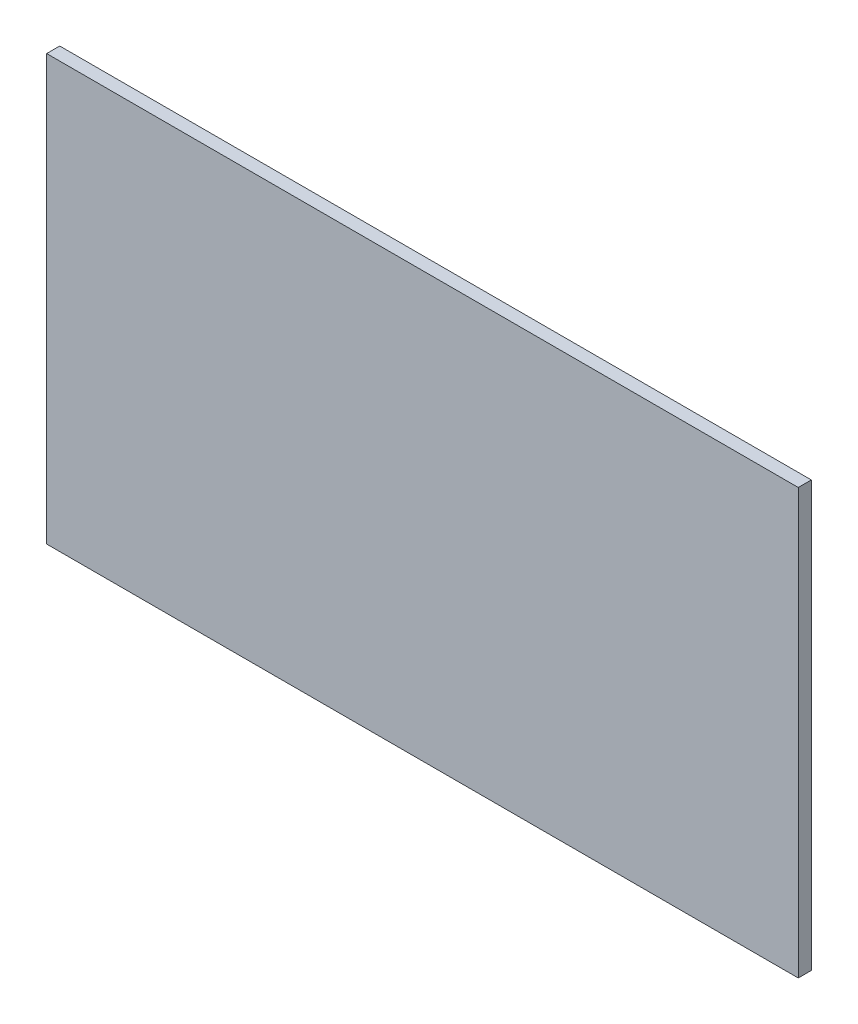
ISO-10303-21;
HEADER;
FILE_DESCRIPTION(('STEP AP214'),'2;1');
FILE_NAME('part.step','',(''),(''),'','','');
FILE_SCHEMA(('AUTOMOTIVE_DESIGN { 1 0 10303 214 1 1 1 1 }'));
ENDSEC;
DATA;
#1=APPLICATION_CONTEXT('core data for automotive mechanical design processes');
#2=APPLICATION_PROTOCOL_DEFINITION('international standard','automotive_design',2000,#1);
#3=PRODUCT_CONTEXT('',#1,'mechanical');
#4=PRODUCT('Part','Part','',(#3));
#5=PRODUCT_RELATED_PRODUCT_CATEGORY('part','',(#4));
#6=PRODUCT_DEFINITION_FORMATION('','',#4);
#7=PRODUCT_DEFINITION_CONTEXT('part definition',#1,'design');
#8=PRODUCT_DEFINITION('design','',#6,#7);
#9=PRODUCT_DEFINITION_SHAPE('','',#8);
#10=(LENGTH_UNIT() NAMED_UNIT(*) SI_UNIT(.MILLI.,.METRE.));
#11=(NAMED_UNIT(*) PLANE_ANGLE_UNIT() SI_UNIT($,.RADIAN.));
#12=(NAMED_UNIT(*) SI_UNIT($,.STERADIAN.) SOLID_ANGLE_UNIT());
#13=UNCERTAINTY_MEASURE_WITH_UNIT(LENGTH_MEASURE(1.E-05),#10,'distance_accuracy_value','');
#14=(GEOMETRIC_REPRESENTATION_CONTEXT(3) GLOBAL_UNCERTAINTY_ASSIGNED_CONTEXT((#13)) GLOBAL_UNIT_ASSIGNED_CONTEXT((#10,
#11,#12)) REPRESENTATION_CONTEXT('',''));
#15=CARTESIAN_POINT('',(0.,0.,0.));
#16=DIRECTION('',(0.,0.,1.));
#17=DIRECTION('',(1.,0.,0.));
#18=AXIS2_PLACEMENT_3D('',#15,#16,#17);
#19=CARTESIAN_POINT('',(0.,0.,4.));
#20=DIRECTION('',(1.,0.,0.));
#21=DIRECTION('',(0.,1.,0.));
#22=AXIS2_PLACEMENT_3D('',#19,#20,#21);
#23=PLANE('',#22);
#24=DIRECTION('',(0.,-1.,0.));
#25=VECTOR('',#24,1.);
#26=CARTESIAN_POINT('',(0.,0.,0.));
#27=LINE('',#26,#25);
#28=CARTESIAN_POINT('',(0.,0.,0.));
#29=VERTEX_POINT('',#28);
#30=CARTESIAN_POINT('',(0.,-130.,0.));
#31=VERTEX_POINT('',#30);
#32=EDGE_CURVE('E113',#29,#31,#27,.T.);
#33=ORIENTED_EDGE('',*,*,#32,.T.);
#34=DIRECTION('',(0.,0.,-1.));
#35=VECTOR('',#34,1.);
#36=CARTESIAN_POINT('',(0.,-130.,4.));
#37=LINE('',#36,#35);
#38=CARTESIAN_POINT('',(0.,-130.,4.));
#39=VERTEX_POINT('',#38);
#40=EDGE_CURVE('E11',#39,#31,#37,.T.);
#41=ORIENTED_EDGE('',*,*,#40,.F.);
#42=DIRECTION('',(0.,-1.,0.));
#43=VECTOR('',#42,1.);
#44=CARTESIAN_POINT('',(0.,0.,4.));
#45=LINE('',#44,#43);
#46=CARTESIAN_POINT('',(0.,0.,4.));
#47=VERTEX_POINT('',#46);
#48=EDGE_CURVE('E97',#47,#39,#45,.T.);
#49=ORIENTED_EDGE('',*,*,#48,.F.);
#50=DIRECTION('',(0.,0.,-1.));
#51=VECTOR('',#50,1.);
#52=CARTESIAN_POINT('',(0.,0.,4.));
#53=LINE('',#52,#51);
#54=EDGE_CURVE('E109',#47,#29,#53,.T.);
#55=ORIENTED_EDGE('',*,*,#54,.T.);
#56=EDGE_LOOP('',(#33,#41,#49,#55));
#57=FACE_BOUND('',#56,.T.);
#58=ADVANCED_FACE('F45',(#57),#23,.F.);
#59=CARTESIAN_POINT('',(0.,-130.,4.));
#60=DIRECTION('',(0.,1.,0.));
#61=DIRECTION('',(0.,0.,1.));
#62=AXIS2_PLACEMENT_3D('',#59,#60,#61);
#63=PLANE('',#62);
#64=DIRECTION('',(1.,0.,0.));
#65=VECTOR('',#64,1.);
#66=CARTESIAN_POINT('',(0.,-130.,0.));
#67=LINE('',#66,#65);
#68=CARTESIAN_POINT('',(230.,-130.,0.));
#69=VERTEX_POINT('',#68);
#70=EDGE_CURVE('E102',#31,#69,#67,.T.);
#71=ORIENTED_EDGE('',*,*,#70,.T.);
#72=DIRECTION('',(0.,0.,-1.));
#73=VECTOR('',#72,1.);
#74=CARTESIAN_POINT('',(230.,-130.,4.));
#75=LINE('',#74,#73);
#76=CARTESIAN_POINT('',(230.,-130.,4.));
#77=VERTEX_POINT('',#76);
#78=EDGE_CURVE('E54',#77,#69,#75,.T.);
#79=ORIENTED_EDGE('',*,*,#78,.F.);
#80=DIRECTION('',(1.,0.,0.));
#81=VECTOR('',#80,1.);
#82=CARTESIAN_POINT('',(0.,-130.,4.));
#83=LINE('',#82,#81);
#84=EDGE_CURVE('E92',#39,#77,#83,.T.);
#85=ORIENTED_EDGE('',*,*,#84,.F.);
#86=ORIENTED_EDGE('',*,*,#40,.T.);
#87=EDGE_LOOP('',(#71,#79,#85,#86));
#88=FACE_BOUND('',#87,.T.);
#89=ADVANCED_FACE('F101',(#88),#63,.F.);
#90=CARTESIAN_POINT('',(230.,0.,4.));
#91=DIRECTION('',(-1.,0.,0.));
#92=DIRECTION('',(0.,-1.,0.));
#93=AXIS2_PLACEMENT_3D('',#90,#91,#92);
#94=PLANE('',#93);
#95=DIRECTION('',(0.,1.,0.));
#96=VECTOR('',#95,1.);
#97=CARTESIAN_POINT('',(230.,0.,0.));
#98=LINE('',#97,#96);
#99=CARTESIAN_POINT('',(230.,0.,0.));
#100=VERTEX_POINT('',#99);
#101=EDGE_CURVE('E79',#69,#100,#98,.T.);
#102=ORIENTED_EDGE('',*,*,#101,.T.);
#103=DIRECTION('',(0.,0.,-1.));
#104=VECTOR('',#103,1.);
#105=CARTESIAN_POINT('',(230.,0.,4.));
#106=LINE('',#105,#104);
#107=CARTESIAN_POINT('',(230.,0.,4.));
#108=VERTEX_POINT('',#107);
#109=EDGE_CURVE('E104',#108,#100,#106,.T.);
#110=ORIENTED_EDGE('',*,*,#109,.F.);
#111=DIRECTION('',(0.,1.,0.));
#112=VECTOR('',#111,1.);
#113=CARTESIAN_POINT('',(230.,0.,4.));
#114=LINE('',#113,#112);
#115=EDGE_CURVE('E95',#77,#108,#114,.T.);
#116=ORIENTED_EDGE('',*,*,#115,.F.);
#117=ORIENTED_EDGE('',*,*,#78,.T.);
#118=EDGE_LOOP('',(#102,#110,#116,#117));
#119=FACE_BOUND('',#118,.T.);
#120=ADVANCED_FACE('F105',(#119),#94,.F.);
#121=CARTESIAN_POINT('',(0.,0.,4.));
#122=DIRECTION('',(0.,-1.,0.));
#123=DIRECTION('',(0.,0.,-1.));
#124=AXIS2_PLACEMENT_3D('',#121,#122,#123);
#125=PLANE('',#124);
#126=DIRECTION('',(-1.,0.,0.));
#127=VECTOR('',#126,1.);
#128=CARTESIAN_POINT('',(0.,0.,0.));
#129=LINE('',#128,#127);
#130=EDGE_CURVE('E85',#100,#29,#129,.T.);
#131=ORIENTED_EDGE('',*,*,#130,.T.);
#132=ORIENTED_EDGE('',*,*,#54,.F.);
#133=DIRECTION('',(-1.,0.,0.));
#134=VECTOR('',#133,1.);
#135=CARTESIAN_POINT('',(0.,0.,4.));
#136=LINE('',#135,#134);
#137=EDGE_CURVE('E62',#108,#47,#136,.T.);
#138=ORIENTED_EDGE('',*,*,#137,.F.);
#139=ORIENTED_EDGE('',*,*,#109,.T.);
#140=EDGE_LOOP('',(#131,#132,#138,#139));
#141=FACE_BOUND('',#140,.T.);
#142=ADVANCED_FACE('F126',(#141),#125,.F.);
#143=CARTESIAN_POINT('',(0.,0.,4.));
#144=DIRECTION('',(0.,0.,1.));
#145=DIRECTION('',(1.,0.,0.));
#146=AXIS2_PLACEMENT_3D('',#143,#144,#145);
#147=PLANE('',#146);
#148=ORIENTED_EDGE('',*,*,#48,.T.);
#149=ORIENTED_EDGE('',*,*,#84,.T.);
#150=ORIENTED_EDGE('',*,*,#115,.T.);
#151=ORIENTED_EDGE('',*,*,#137,.T.);
#152=EDGE_LOOP('',(#148,#149,#150,#151));
#153=FACE_BOUND('',#152,.T.);
#154=ADVANCED_FACE('F93',(#153),#147,.T.);
#155=CARTESIAN_POINT('',(0.,0.,0.));
#156=DIRECTION('',(0.,0.,1.));
#157=DIRECTION('',(1.,0.,0.));
#158=AXIS2_PLACEMENT_3D('',#155,#156,#157);
#159=PLANE('',#158);
#160=ORIENTED_EDGE('',*,*,#32,.F.);
#161=ORIENTED_EDGE('',*,*,#130,.F.);
#162=ORIENTED_EDGE('',*,*,#101,.F.);
#163=ORIENTED_EDGE('',*,*,#70,.F.);
#164=EDGE_LOOP('',(#160,#161,#162,#163));
#165=FACE_BOUND('',#164,.T.);
#166=ADVANCED_FACE('F129',(#165),#159,.F.);
#167=CLOSED_SHELL('',(#58,#89,#120,#142,#154,#166));
#168=MANIFOLD_SOLID_BREP('B2',#167);
#169=ADVANCED_BREP_SHAPE_REPRESENTATION('',(#18,#168),#14);
#170=SHAPE_DEFINITION_REPRESENTATION(#9,#169);
ENDSEC;
END-ISO-10303-21;
